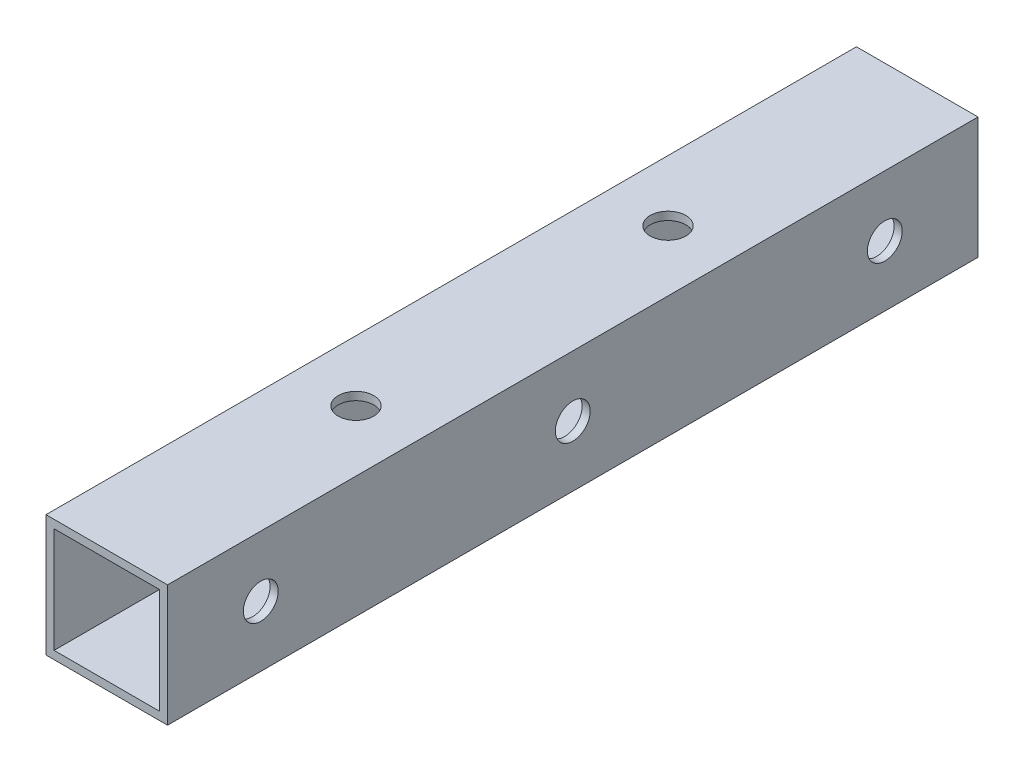
ISO-10303-21;
HEADER;
FILE_DESCRIPTION(('STEP AP214'),'2;1');
FILE_NAME('part.step','',(''),(''),'','','');
FILE_SCHEMA(('AUTOMOTIVE_DESIGN { 1 0 10303 214 1 1 1 1 }'));
ENDSEC;
DATA;
#1=APPLICATION_CONTEXT('core data for automotive mechanical design processes');
#2=APPLICATION_PROTOCOL_DEFINITION('international standard','automotive_design',2000,#1);
#3=PRODUCT_CONTEXT('',#1,'mechanical');
#4=PRODUCT('Part','Part','',(#3));
#5=PRODUCT_RELATED_PRODUCT_CATEGORY('part','',(#4));
#6=PRODUCT_DEFINITION_FORMATION('','',#4);
#7=PRODUCT_DEFINITION_CONTEXT('part definition',#1,'design');
#8=PRODUCT_DEFINITION('design','',#6,#7);
#9=PRODUCT_DEFINITION_SHAPE('','',#8);
#10=(LENGTH_UNIT() NAMED_UNIT(*) SI_UNIT(.MILLI.,.METRE.));
#11=(NAMED_UNIT(*) PLANE_ANGLE_UNIT() SI_UNIT($,.RADIAN.));
#12=(NAMED_UNIT(*) SI_UNIT($,.STERADIAN.) SOLID_ANGLE_UNIT());
#13=UNCERTAINTY_MEASURE_WITH_UNIT(LENGTH_MEASURE(1.E-05),#10,'distance_accuracy_value','');
#14=(GEOMETRIC_REPRESENTATION_CONTEXT(3) GLOBAL_UNCERTAINTY_ASSIGNED_CONTEXT((#13)) GLOBAL_UNIT_ASSIGNED_CONTEXT((#10,
#11,#12)) REPRESENTATION_CONTEXT('',''));
#15=CARTESIAN_POINT('',(0.,0.,0.));
#16=DIRECTION('',(0.,0.,1.));
#17=DIRECTION('',(1.,0.,0.));
#18=AXIS2_PLACEMENT_3D('',#15,#16,#17);
#19=CARTESIAN_POINT('',(0.,0.,100.));
#20=DIRECTION('',(0.,0.,1.));
#21=DIRECTION('',(1.,0.,0.));
#22=AXIS2_PLACEMENT_3D('',#19,#20,#21);
#23=PLANE('',#22);
#24=DIRECTION('',(0.,1.,0.));
#25=VECTOR('',#24,1.);
#26=CARTESIAN_POINT('',(7.5,7.5,100.));
#27=LINE('',#26,#25);
#28=CARTESIAN_POINT('',(7.5,-7.5,100.));
#29=VERTEX_POINT('',#28);
#30=CARTESIAN_POINT('',(7.5,7.5,100.));
#31=VERTEX_POINT('',#30);
#32=EDGE_CURVE('E143',#29,#31,#27,.T.);
#33=ORIENTED_EDGE('',*,*,#32,.T.);
#34=DIRECTION('',(-1.,0.,0.));
#35=VECTOR('',#34,1.);
#36=CARTESIAN_POINT('',(-7.5,7.5,100.));
#37=LINE('',#36,#35);
#38=CARTESIAN_POINT('',(-7.5,7.5,100.));
#39=VERTEX_POINT('',#38);
#40=EDGE_CURVE('E146',#31,#39,#37,.T.);
#41=ORIENTED_EDGE('',*,*,#40,.T.);
#42=DIRECTION('',(0.,-1.,0.));
#43=VECTOR('',#42,1.);
#44=CARTESIAN_POINT('',(-7.5,7.5,100.));
#45=LINE('',#44,#43);
#46=CARTESIAN_POINT('',(-7.5,-7.5,100.));
#47=VERTEX_POINT('',#46);
#48=EDGE_CURVE('E149',#39,#47,#45,.T.);
#49=ORIENTED_EDGE('',*,*,#48,.T.);
#50=DIRECTION('',(1.,0.,0.));
#51=VECTOR('',#50,1.);
#52=CARTESIAN_POINT('',(-7.5,-7.5,100.));
#53=LINE('',#52,#51);
#54=EDGE_CURVE('E151',#47,#29,#53,.T.);
#55=ORIENTED_EDGE('',*,*,#54,.T.);
#56=EDGE_LOOP('',(#33,#41,#49,#55));
#57=FACE_BOUND('',#56,.T.);
#58=DIRECTION('',(-1.,0.,0.));
#59=VECTOR('',#58,1.);
#60=CARTESIAN_POINT('',(-6.5,6.5,100.));
#61=LINE('',#60,#59);
#62=CARTESIAN_POINT('',(6.5,6.5,100.));
#63=VERTEX_POINT('',#62);
#64=CARTESIAN_POINT('',(-6.5,6.5,100.));
#65=VERTEX_POINT('',#64);
#66=EDGE_CURVE('E113',#63,#65,#61,.T.);
#67=ORIENTED_EDGE('',*,*,#66,.F.);
#68=DIRECTION('',(0.,1.,0.));
#69=VECTOR('',#68,1.);
#70=CARTESIAN_POINT('',(6.5,6.5,100.));
#71=LINE('',#70,#69);
#72=CARTESIAN_POINT('',(6.5,-6.5,100.));
#73=VERTEX_POINT('',#72);
#74=EDGE_CURVE('E105',#73,#63,#71,.T.);
#75=ORIENTED_EDGE('',*,*,#74,.F.);
#76=DIRECTION('',(1.,0.,0.));
#77=VECTOR('',#76,1.);
#78=CARTESIAN_POINT('',(-6.5,-6.5,100.));
#79=LINE('',#78,#77);
#80=CARTESIAN_POINT('',(-6.5,-6.5,100.));
#81=VERTEX_POINT('',#80);
#82=EDGE_CURVE('E127',#81,#73,#79,.T.);
#83=ORIENTED_EDGE('',*,*,#82,.F.);
#84=DIRECTION('',(0.,-1.,0.));
#85=VECTOR('',#84,1.);
#86=CARTESIAN_POINT('',(-6.5,6.5,100.));
#87=LINE('',#86,#85);
#88=EDGE_CURVE('E125',#65,#81,#87,.T.);
#89=ORIENTED_EDGE('',*,*,#88,.F.);
#90=EDGE_LOOP('',(#67,#75,#83,#89));
#91=FACE_BOUND('',#90,.T.);
#92=ADVANCED_FACE('F38',(#57,#91),#23,.T.);
#93=CARTESIAN_POINT('',(0.,0.,0.));
#94=DIRECTION('',(0.,0.,1.));
#95=DIRECTION('',(1.,0.,0.));
#96=AXIS2_PLACEMENT_3D('',#93,#94,#95);
#97=PLANE('',#96);
#98=DIRECTION('',(0.,1.,0.));
#99=VECTOR('',#98,1.);
#100=CARTESIAN_POINT('',(7.5,7.5,0.));
#101=LINE('',#100,#99);
#102=CARTESIAN_POINT('',(7.5,-7.5,0.));
#103=VERTEX_POINT('',#102);
#104=CARTESIAN_POINT('',(7.5,7.5,0.));
#105=VERTEX_POINT('',#104);
#106=EDGE_CURVE('E121',#103,#105,#101,.T.);
#107=ORIENTED_EDGE('',*,*,#106,.F.);
#108=DIRECTION('',(1.,0.,0.));
#109=VECTOR('',#108,1.);
#110=CARTESIAN_POINT('',(-7.5,-7.5,0.));
#111=LINE('',#110,#109);
#112=CARTESIAN_POINT('',(-7.5,-7.5,0.));
#113=VERTEX_POINT('',#112);
#114=EDGE_CURVE('E147',#113,#103,#111,.T.);
#115=ORIENTED_EDGE('',*,*,#114,.F.);
#116=DIRECTION('',(0.,-1.,0.));
#117=VECTOR('',#116,1.);
#118=CARTESIAN_POINT('',(-7.5,7.5,0.));
#119=LINE('',#118,#117);
#120=CARTESIAN_POINT('',(-7.5,7.5,0.));
#121=VERTEX_POINT('',#120);
#122=EDGE_CURVE('E158',#121,#113,#119,.T.);
#123=ORIENTED_EDGE('',*,*,#122,.F.);
#124=DIRECTION('',(-1.,0.,0.));
#125=VECTOR('',#124,1.);
#126=CARTESIAN_POINT('',(-7.5,7.5,0.));
#127=LINE('',#126,#125);
#128=EDGE_CURVE('E156',#105,#121,#127,.T.);
#129=ORIENTED_EDGE('',*,*,#128,.F.);
#130=EDGE_LOOP('',(#107,#115,#123,#129));
#131=FACE_BOUND('',#130,.T.);
#132=DIRECTION('',(0.,1.,0.));
#133=VECTOR('',#132,1.);
#134=CARTESIAN_POINT('',(6.5,6.5,0.));
#135=LINE('',#134,#133);
#136=CARTESIAN_POINT('',(6.5,-6.5,0.));
#137=VERTEX_POINT('',#136);
#138=CARTESIAN_POINT('',(6.5,6.5,0.));
#139=VERTEX_POINT('',#138);
#140=EDGE_CURVE('E63',#137,#139,#135,.T.);
#141=ORIENTED_EDGE('',*,*,#140,.T.);
#142=DIRECTION('',(-1.,0.,0.));
#143=VECTOR('',#142,1.);
#144=CARTESIAN_POINT('',(-6.5,6.5,0.));
#145=LINE('',#144,#143);
#146=CARTESIAN_POINT('',(-6.5,6.5,0.));
#147=VERTEX_POINT('',#146);
#148=EDGE_CURVE('E120',#139,#147,#145,.T.);
#149=ORIENTED_EDGE('',*,*,#148,.T.);
#150=DIRECTION('',(0.,-1.,0.));
#151=VECTOR('',#150,1.);
#152=CARTESIAN_POINT('',(-6.5,6.5,0.));
#153=LINE('',#152,#151);
#154=CARTESIAN_POINT('',(-6.5,-6.5,0.));
#155=VERTEX_POINT('',#154);
#156=EDGE_CURVE('E135',#147,#155,#153,.T.);
#157=ORIENTED_EDGE('',*,*,#156,.T.);
#158=DIRECTION('',(1.,0.,0.));
#159=VECTOR('',#158,1.);
#160=CARTESIAN_POINT('',(-6.5,-6.5,0.));
#161=LINE('',#160,#159);
#162=EDGE_CURVE('E114',#155,#137,#161,.T.);
#163=ORIENTED_EDGE('',*,*,#162,.T.);
#164=EDGE_LOOP('',(#141,#149,#157,#163));
#165=FACE_BOUND('',#164,.T.);
#166=ADVANCED_FACE('F251',(#131,#165),#97,.F.);
#167=CARTESIAN_POINT('',(7.5,7.5,100.));
#168=DIRECTION('',(-1.,0.,0.));
#169=DIRECTION('',(0.,-1.,0.));
#170=AXIS2_PLACEMENT_3D('',#167,#168,#169);
#171=PLANE('',#170);
#172=CARTESIAN_POINT('',(7.5,0.,11.5));
#173=DIRECTION('',(1.,0.,0.));
#174=DIRECTION('',(0.,1.,0.));
#175=AXIS2_PLACEMENT_3D('',#172,#173,#174);
#176=CIRCLE('',#175,2.15);
#177=CARTESIAN_POINT('',(7.5,2.15000000000001,11.5));
#178=VERTEX_POINT('',#177);
#179=EDGE_CURVE('E207',#178,#178,#176,.T.);
#180=ORIENTED_EDGE('',*,*,#179,.F.);
#181=EDGE_LOOP('',(#180));
#182=FACE_BOUND('',#181,.T.);
#183=CARTESIAN_POINT('',(7.5,0.,88.5));
#184=DIRECTION('',(1.,0.,0.));
#185=DIRECTION('',(0.,1.,0.));
#186=AXIS2_PLACEMENT_3D('',#183,#184,#185);
#187=CIRCLE('',#186,2.15);
#188=CARTESIAN_POINT('',(7.5,2.15,88.5));
#189=VERTEX_POINT('',#188);
#190=EDGE_CURVE('E208',#189,#189,#187,.T.);
#191=ORIENTED_EDGE('',*,*,#190,.F.);
#192=EDGE_LOOP('',(#191));
#193=FACE_BOUND('',#192,.T.);
#194=CARTESIAN_POINT('',(7.5,0.,50.));
#195=DIRECTION('',(1.,0.,0.));
#196=DIRECTION('',(0.,1.,0.));
#197=AXIS2_PLACEMENT_3D('',#194,#195,#196);
#198=CIRCLE('',#197,2.15);
#199=CARTESIAN_POINT('',(7.5,2.15,50.));
#200=VERTEX_POINT('',#199);
#201=EDGE_CURVE('E172',#200,#200,#198,.T.);
#202=ORIENTED_EDGE('',*,*,#201,.F.);
#203=EDGE_LOOP('',(#202));
#204=FACE_BOUND('',#203,.T.);
#205=ORIENTED_EDGE('',*,*,#106,.T.);
#206=DIRECTION('',(0.,0.,-1.));
#207=VECTOR('',#206,1.);
#208=CARTESIAN_POINT('',(7.5,7.5,100.));
#209=LINE('',#208,#207);
#210=EDGE_CURVE('E11',#31,#105,#209,.T.);
#211=ORIENTED_EDGE('',*,*,#210,.F.);
#212=ORIENTED_EDGE('',*,*,#32,.F.);
#213=DIRECTION('',(0.,0.,-1.));
#214=VECTOR('',#213,1.);
#215=CARTESIAN_POINT('',(7.5,-7.5,100.));
#216=LINE('',#215,#214);
#217=EDGE_CURVE('E153',#29,#103,#216,.T.);
#218=ORIENTED_EDGE('',*,*,#217,.T.);
#219=EDGE_LOOP('',(#205,#211,#212,#218));
#220=FACE_BOUND('',#219,.T.);
#221=ADVANCED_FACE('F40',(#182,#193,#204,#220),#171,.F.);
#222=CARTESIAN_POINT('',(-7.5,7.5,100.));
#223=DIRECTION('',(0.,-1.,0.));
#224=DIRECTION('',(0.,0.,-1.));
#225=AXIS2_PLACEMENT_3D('',#222,#223,#224);
#226=PLANE('',#225);
#227=CARTESIAN_POINT('',(0.,7.5,30.75));
#228=DIRECTION('',(0.,1.,0.));
#229=DIRECTION('',(0.,0.,1.));
#230=AXIS2_PLACEMENT_3D('',#227,#228,#229);
#231=CIRCLE('',#230,2.2);
#232=CARTESIAN_POINT('',(0.,7.5,32.95));
#233=VERTEX_POINT('',#232);
#234=EDGE_CURVE('E185',#233,#233,#231,.T.);
#235=ORIENTED_EDGE('',*,*,#234,.F.);
#236=EDGE_LOOP('',(#235));
#237=FACE_BOUND('',#236,.T.);
#238=CARTESIAN_POINT('',(0.,7.5,69.25));
#239=DIRECTION('',(0.,1.,0.));
#240=DIRECTION('',(0.,0.,1.));
#241=AXIS2_PLACEMENT_3D('',#238,#239,#240);
#242=CIRCLE('',#241,2.2);
#243=CARTESIAN_POINT('',(0.,7.5,71.45));
#244=VERTEX_POINT('',#243);
#245=EDGE_CURVE('E192',#244,#244,#242,.T.);
#246=ORIENTED_EDGE('',*,*,#245,.F.);
#247=EDGE_LOOP('',(#246));
#248=FACE_BOUND('',#247,.T.);
#249=ORIENTED_EDGE('',*,*,#128,.T.);
#250=DIRECTION('',(0.,0.,-1.));
#251=VECTOR('',#250,1.);
#252=CARTESIAN_POINT('',(-7.5,7.5,100.));
#253=LINE('',#252,#251);
#254=EDGE_CURVE('E47',#39,#121,#253,.T.);
#255=ORIENTED_EDGE('',*,*,#254,.F.);
#256=ORIENTED_EDGE('',*,*,#40,.F.);
#257=ORIENTED_EDGE('',*,*,#210,.T.);
#258=EDGE_LOOP('',(#249,#255,#256,#257));
#259=FACE_BOUND('',#258,.T.);
#260=ADVANCED_FACE('F267',(#237,#248,#259),#226,.F.);
#261=CARTESIAN_POINT('',(-7.5,7.5,100.));
#262=DIRECTION('',(1.,0.,0.));
#263=DIRECTION('',(0.,1.,0.));
#264=AXIS2_PLACEMENT_3D('',#261,#262,#263);
#265=PLANE('',#264);
#266=CARTESIAN_POINT('',(-7.50000000000001,0.,11.5));
#267=DIRECTION('',(1.,0.,0.));
#268=DIRECTION('',(0.,1.,0.));
#269=AXIS2_PLACEMENT_3D('',#266,#267,#268);
#270=CIRCLE('',#269,2.15);
#271=CARTESIAN_POINT('',(-7.50000000000001,2.15000000000001,11.5));
#272=VERTEX_POINT('',#271);
#273=EDGE_CURVE('E133',#272,#272,#270,.T.);
#274=ORIENTED_EDGE('',*,*,#273,.T.);
#275=EDGE_LOOP('',(#274));
#276=FACE_BOUND('',#275,.T.);
#277=CARTESIAN_POINT('',(-7.50000000000001,0.,88.5));
#278=DIRECTION('',(1.,0.,0.));
#279=DIRECTION('',(0.,1.,0.));
#280=AXIS2_PLACEMENT_3D('',#277,#278,#279);
#281=CIRCLE('',#280,2.15);
#282=CARTESIAN_POINT('',(-7.50000000000001,2.15,88.5));
#283=VERTEX_POINT('',#282);
#284=EDGE_CURVE('E181',#283,#283,#281,.T.);
#285=ORIENTED_EDGE('',*,*,#284,.T.);
#286=EDGE_LOOP('',(#285));
#287=FACE_BOUND('',#286,.T.);
#288=CARTESIAN_POINT('',(-7.50000000000001,0.,50.));
#289=DIRECTION('',(1.,0.,0.));
#290=DIRECTION('',(0.,1.,0.));
#291=AXIS2_PLACEMENT_3D('',#288,#289,#290);
#292=CIRCLE('',#291,2.15);
#293=CARTESIAN_POINT('',(-7.50000000000001,2.15,50.));
#294=VERTEX_POINT('',#293);
#295=EDGE_CURVE('E177',#294,#294,#292,.T.);
#296=ORIENTED_EDGE('',*,*,#295,.T.);
#297=EDGE_LOOP('',(#296));
#298=FACE_BOUND('',#297,.T.);
#299=ORIENTED_EDGE('',*,*,#122,.T.);
#300=DIRECTION('',(0.,0.,-1.));
#301=VECTOR('',#300,1.);
#302=CARTESIAN_POINT('',(-7.5,-7.5,100.));
#303=LINE('',#302,#301);
#304=EDGE_CURVE('E163',#47,#113,#303,.T.);
#305=ORIENTED_EDGE('',*,*,#304,.F.);
#306=ORIENTED_EDGE('',*,*,#48,.F.);
#307=ORIENTED_EDGE('',*,*,#254,.T.);
#308=EDGE_LOOP('',(#299,#305,#306,#307));
#309=FACE_BOUND('',#308,.T.);
#310=ADVANCED_FACE('F227',(#276,#287,#298,#309),#265,.F.);
#311=CARTESIAN_POINT('',(-7.5,-7.5,100.));
#312=DIRECTION('',(0.,1.,0.));
#313=DIRECTION('',(0.,0.,1.));
#314=AXIS2_PLACEMENT_3D('',#311,#312,#313);
#315=PLANE('',#314);
#316=CARTESIAN_POINT('',(0.,-7.5,30.75));
#317=DIRECTION('',(0.,1.,0.));
#318=DIRECTION('',(0.,0.,1.));
#319=AXIS2_PLACEMENT_3D('',#316,#317,#318);
#320=CIRCLE('',#319,2.2);
#321=CARTESIAN_POINT('',(0.,-7.5,32.95));
#322=VERTEX_POINT('',#321);
#323=EDGE_CURVE('E204',#322,#322,#320,.T.);
#324=ORIENTED_EDGE('',*,*,#323,.T.);
#325=EDGE_LOOP('',(#324));
#326=FACE_BOUND('',#325,.T.);
#327=CARTESIAN_POINT('',(0.,-7.5,69.25));
#328=DIRECTION('',(0.,1.,0.));
#329=DIRECTION('',(0.,0.,1.));
#330=AXIS2_PLACEMENT_3D('',#327,#328,#329);
#331=CIRCLE('',#330,2.2);
#332=CARTESIAN_POINT('',(0.,-7.5,71.45));
#333=VERTEX_POINT('',#332);
#334=EDGE_CURVE('E189',#333,#333,#331,.T.);
#335=ORIENTED_EDGE('',*,*,#334,.T.);
#336=EDGE_LOOP('',(#335));
#337=FACE_BOUND('',#336,.T.);
#338=ORIENTED_EDGE('',*,*,#114,.T.);
#339=ORIENTED_EDGE('',*,*,#217,.F.);
#340=ORIENTED_EDGE('',*,*,#54,.F.);
#341=ORIENTED_EDGE('',*,*,#304,.T.);
#342=EDGE_LOOP('',(#338,#339,#340,#341));
#343=FACE_BOUND('',#342,.T.);
#344=ADVANCED_FACE('F262',(#326,#337,#343),#315,.F.);
#345=CARTESIAN_POINT('',(6.5,6.5,100.));
#346=DIRECTION('',(-1.,0.,0.));
#347=DIRECTION('',(0.,0.,1.));
#348=AXIS2_PLACEMENT_3D('',#345,#346,#347);
#349=PLANE('',#348);
#350=CARTESIAN_POINT('',(6.50000000000001,0.,11.5));
#351=DIRECTION('',(-1.,0.,0.));
#352=DIRECTION('',(0.,0.,1.));
#353=AXIS2_PLACEMENT_3D('',#350,#351,#352);
#354=CIRCLE('',#353,2.15);
#355=CARTESIAN_POINT('',(6.50000000000001,0.,13.65));
#356=VERTEX_POINT('',#355);
#357=EDGE_CURVE('E180',#356,#356,#354,.T.);
#358=ORIENTED_EDGE('',*,*,#357,.F.);
#359=EDGE_LOOP('',(#358));
#360=FACE_BOUND('',#359,.T.);
#361=CARTESIAN_POINT('',(6.50000000000001,0.,88.5));
#362=DIRECTION('',(-1.,0.,0.));
#363=DIRECTION('',(0.,0.,1.));
#364=AXIS2_PLACEMENT_3D('',#361,#362,#363);
#365=CIRCLE('',#364,2.15);
#366=CARTESIAN_POINT('',(6.50000000000001,0.,90.65));
#367=VERTEX_POINT('',#366);
#368=EDGE_CURVE('E176',#367,#367,#365,.T.);
#369=ORIENTED_EDGE('',*,*,#368,.F.);
#370=EDGE_LOOP('',(#369));
#371=FACE_BOUND('',#370,.T.);
#372=CARTESIAN_POINT('',(6.50000000000001,0.,50.));
#373=DIRECTION('',(-1.,0.,0.));
#374=DIRECTION('',(0.,0.,1.));
#375=AXIS2_PLACEMENT_3D('',#372,#373,#374);
#376=CIRCLE('',#375,2.15);
#377=CARTESIAN_POINT('',(6.50000000000001,0.,52.15));
#378=VERTEX_POINT('',#377);
#379=EDGE_CURVE('E171',#378,#378,#376,.T.);
#380=ORIENTED_EDGE('',*,*,#379,.F.);
#381=EDGE_LOOP('',(#380));
#382=FACE_BOUND('',#381,.T.);
#383=ORIENTED_EDGE('',*,*,#140,.F.);
#384=DIRECTION('',(0.,0.,-1.));
#385=VECTOR('',#384,1.);
#386=CARTESIAN_POINT('',(6.5,-6.5,100.));
#387=LINE('',#386,#385);
#388=EDGE_CURVE('E109',#73,#137,#387,.T.);
#389=ORIENTED_EDGE('',*,*,#388,.F.);
#390=ORIENTED_EDGE('',*,*,#74,.T.);
#391=DIRECTION('',(0.,0.,-1.));
#392=VECTOR('',#391,1.);
#393=CARTESIAN_POINT('',(6.5,6.5,100.));
#394=LINE('',#393,#392);
#395=EDGE_CURVE('E108',#63,#139,#394,.T.);
#396=ORIENTED_EDGE('',*,*,#395,.T.);
#397=EDGE_LOOP('',(#383,#389,#390,#396));
#398=FACE_BOUND('',#397,.T.);
#399=ADVANCED_FACE('F107',(#360,#371,#382,#398),#349,.T.);
#400=CARTESIAN_POINT('',(-6.5,6.5,100.));
#401=DIRECTION('',(0.,-1.,0.));
#402=DIRECTION('',(0.,0.,-1.));
#403=AXIS2_PLACEMENT_3D('',#400,#401,#402);
#404=PLANE('',#403);
#405=CARTESIAN_POINT('',(0.,6.5,30.75));
#406=DIRECTION('',(0.,-1.,0.));
#407=DIRECTION('',(0.,0.,-1.));
#408=AXIS2_PLACEMENT_3D('',#405,#406,#407);
#409=CIRCLE('',#408,2.2);
#410=CARTESIAN_POINT('',(0.,6.5,28.55));
#411=VERTEX_POINT('',#410);
#412=EDGE_CURVE('E201',#411,#411,#409,.T.);
#413=ORIENTED_EDGE('',*,*,#412,.F.);
#414=EDGE_LOOP('',(#413));
#415=FACE_BOUND('',#414,.T.);
#416=CARTESIAN_POINT('',(0.,6.5,69.25));
#417=DIRECTION('',(0.,-1.,0.));
#418=DIRECTION('',(0.,0.,-1.));
#419=AXIS2_PLACEMENT_3D('',#416,#417,#418);
#420=CIRCLE('',#419,2.2);
#421=CARTESIAN_POINT('',(0.,6.5,67.05));
#422=VERTEX_POINT('',#421);
#423=EDGE_CURVE('E184',#422,#422,#420,.T.);
#424=ORIENTED_EDGE('',*,*,#423,.F.);
#425=EDGE_LOOP('',(#424));
#426=FACE_BOUND('',#425,.T.);
#427=ORIENTED_EDGE('',*,*,#148,.F.);
#428=ORIENTED_EDGE('',*,*,#395,.F.);
#429=ORIENTED_EDGE('',*,*,#66,.T.);
#430=DIRECTION('',(0.,0.,-1.));
#431=VECTOR('',#430,1.);
#432=CARTESIAN_POINT('',(-6.5,6.5,100.));
#433=LINE('',#432,#431);
#434=EDGE_CURVE('E122',#65,#147,#433,.T.);
#435=ORIENTED_EDGE('',*,*,#434,.T.);
#436=EDGE_LOOP('',(#427,#428,#429,#435));
#437=FACE_BOUND('',#436,.T.);
#438=ADVANCED_FACE('F117',(#415,#426,#437),#404,.T.);
#439=CARTESIAN_POINT('',(-6.5,6.5,100.));
#440=DIRECTION('',(1.,0.,0.));
#441=DIRECTION('',(0.,0.,-1.));
#442=AXIS2_PLACEMENT_3D('',#439,#440,#441);
#443=PLANE('',#442);
#444=CARTESIAN_POINT('',(-6.50000000000001,0.,11.5));
#445=DIRECTION('',(1.,0.,0.));
#446=DIRECTION('',(0.,0.,-1.));
#447=AXIS2_PLACEMENT_3D('',#444,#445,#446);
#448=CIRCLE('',#447,2.15);
#449=CARTESIAN_POINT('',(-6.50000000000001,0.,9.35000000000001));
#450=VERTEX_POINT('',#449);
#451=EDGE_CURVE('E178',#450,#450,#448,.T.);
#452=ORIENTED_EDGE('',*,*,#451,.F.);
#453=EDGE_LOOP('',(#452));
#454=FACE_BOUND('',#453,.T.);
#455=CARTESIAN_POINT('',(-6.50000000000001,0.,88.5));
#456=DIRECTION('',(1.,0.,0.));
#457=DIRECTION('',(0.,0.,-1.));
#458=AXIS2_PLACEMENT_3D('',#455,#456,#457);
#459=CIRCLE('',#458,2.15);
#460=CARTESIAN_POINT('',(-6.50000000000001,0.,86.35));
#461=VERTEX_POINT('',#460);
#462=EDGE_CURVE('E173',#461,#461,#459,.T.);
#463=ORIENTED_EDGE('',*,*,#462,.F.);
#464=EDGE_LOOP('',(#463));
#465=FACE_BOUND('',#464,.T.);
#466=CARTESIAN_POINT('',(-6.50000000000001,0.,50.));
#467=DIRECTION('',(1.,0.,0.));
#468=DIRECTION('',(0.,0.,-1.));
#469=AXIS2_PLACEMENT_3D('',#466,#467,#468);
#470=CIRCLE('',#469,2.15);
#471=CARTESIAN_POINT('',(-6.50000000000001,0.,47.85));
#472=VERTEX_POINT('',#471);
#473=EDGE_CURVE('E168',#472,#472,#470,.T.);
#474=ORIENTED_EDGE('',*,*,#473,.F.);
#475=EDGE_LOOP('',(#474));
#476=FACE_BOUND('',#475,.T.);
#477=ORIENTED_EDGE('',*,*,#156,.F.);
#478=ORIENTED_EDGE('',*,*,#434,.F.);
#479=ORIENTED_EDGE('',*,*,#88,.T.);
#480=DIRECTION('',(0.,0.,-1.));
#481=VECTOR('',#480,1.);
#482=CARTESIAN_POINT('',(-6.5,-6.5,100.));
#483=LINE('',#482,#481);
#484=EDGE_CURVE('E55',#81,#155,#483,.T.);
#485=ORIENTED_EDGE('',*,*,#484,.T.);
#486=EDGE_LOOP('',(#477,#478,#479,#485));
#487=FACE_BOUND('',#486,.T.);
#488=ADVANCED_FACE('F294',(#454,#465,#476,#487),#443,.T.);
#489=CARTESIAN_POINT('',(-6.5,-6.5,100.));
#490=DIRECTION('',(0.,1.,0.));
#491=DIRECTION('',(0.,0.,1.));
#492=AXIS2_PLACEMENT_3D('',#489,#490,#491);
#493=PLANE('',#492);
#494=CARTESIAN_POINT('',(0.,-6.5,30.75));
#495=DIRECTION('',(0.,1.,0.));
#496=DIRECTION('',(0.,0.,1.));
#497=AXIS2_PLACEMENT_3D('',#494,#495,#496);
#498=CIRCLE('',#497,2.2);
#499=CARTESIAN_POINT('',(0.,-6.5,32.95));
#500=VERTEX_POINT('',#499);
#501=EDGE_CURVE('E42',#500,#500,#498,.T.);
#502=ORIENTED_EDGE('',*,*,#501,.F.);
#503=EDGE_LOOP('',(#502));
#504=FACE_BOUND('',#503,.T.);
#505=CARTESIAN_POINT('',(0.,-6.5,69.25));
#506=DIRECTION('',(0.,1.,0.));
#507=DIRECTION('',(0.,0.,1.));
#508=AXIS2_PLACEMENT_3D('',#505,#506,#507);
#509=CIRCLE('',#508,2.2);
#510=CARTESIAN_POINT('',(0.,-6.5,71.45));
#511=VERTEX_POINT('',#510);
#512=EDGE_CURVE('E182',#511,#511,#509,.T.);
#513=ORIENTED_EDGE('',*,*,#512,.F.);
#514=EDGE_LOOP('',(#513));
#515=FACE_BOUND('',#514,.T.);
#516=ORIENTED_EDGE('',*,*,#162,.F.);
#517=ORIENTED_EDGE('',*,*,#484,.F.);
#518=ORIENTED_EDGE('',*,*,#82,.T.);
#519=ORIENTED_EDGE('',*,*,#388,.T.);
#520=EDGE_LOOP('',(#516,#517,#518,#519));
#521=FACE_BOUND('',#520,.T.);
#522=ADVANCED_FACE('F292',(#504,#515,#521),#493,.T.);
#523=CARTESIAN_POINT('',(-358.5,0.,50.));
#524=DIRECTION('',(1.,0.,0.));
#525=DIRECTION('',(0.,1.,0.));
#526=AXIS2_PLACEMENT_3D('',#523,#524,#525);
#527=CYLINDRICAL_SURFACE('',#526,2.15);
#528=ORIENTED_EDGE('',*,*,#473,.T.);
#529=EDGE_LOOP('',(#528));
#530=FACE_BOUND('',#529,.T.);
#531=ORIENTED_EDGE('',*,*,#295,.F.);
#532=EDGE_LOOP('',(#531));
#533=FACE_BOUND('',#532,.T.);
#534=ADVANCED_FACE('F244',(#530,#533),#527,.F.);
#535=CARTESIAN_POINT('',(-358.5,0.,88.5));
#536=DIRECTION('',(1.,0.,0.));
#537=DIRECTION('',(0.,1.,0.));
#538=AXIS2_PLACEMENT_3D('',#535,#536,#537);
#539=CYLINDRICAL_SURFACE('',#538,2.15);
#540=ORIENTED_EDGE('',*,*,#462,.T.);
#541=EDGE_LOOP('',(#540));
#542=FACE_BOUND('',#541,.T.);
#543=ORIENTED_EDGE('',*,*,#284,.F.);
#544=EDGE_LOOP('',(#543));
#545=FACE_BOUND('',#544,.T.);
#546=ADVANCED_FACE('F233',(#542,#545),#539,.F.);
#547=CARTESIAN_POINT('',(-358.5,0.,11.5));
#548=DIRECTION('',(1.,0.,0.));
#549=DIRECTION('',(0.,1.,0.));
#550=AXIS2_PLACEMENT_3D('',#547,#548,#549);
#551=CYLINDRICAL_SURFACE('',#550,2.15);
#552=ORIENTED_EDGE('',*,*,#451,.T.);
#553=EDGE_LOOP('',(#552));
#554=FACE_BOUND('',#553,.T.);
#555=ORIENTED_EDGE('',*,*,#273,.F.);
#556=EDGE_LOOP('',(#555));
#557=FACE_BOUND('',#556,.T.);
#558=ADVANCED_FACE('F230',(#554,#557),#551,.F.);
#559=ORIENTED_EDGE('',*,*,#379,.T.);
#560=EDGE_LOOP('',(#559));
#561=FACE_BOUND('',#560,.T.);
#562=ORIENTED_EDGE('',*,*,#201,.T.);
#563=EDGE_LOOP('',(#562));
#564=FACE_BOUND('',#563,.T.);
#565=ADVANCED_FACE('F232',(#561,#564),#527,.F.);
#566=ORIENTED_EDGE('',*,*,#368,.T.);
#567=EDGE_LOOP('',(#566));
#568=FACE_BOUND('',#567,.T.);
#569=ORIENTED_EDGE('',*,*,#190,.T.);
#570=EDGE_LOOP('',(#569));
#571=FACE_BOUND('',#570,.T.);
#572=ADVANCED_FACE('F241',(#568,#571),#539,.F.);
#573=ORIENTED_EDGE('',*,*,#357,.T.);
#574=EDGE_LOOP('',(#573));
#575=FACE_BOUND('',#574,.T.);
#576=ORIENTED_EDGE('',*,*,#179,.T.);
#577=EDGE_LOOP('',(#576));
#578=FACE_BOUND('',#577,.T.);
#579=ADVANCED_FACE('F236',(#575,#578),#551,.F.);
#580=CARTESIAN_POINT('',(0.,-47.5,69.25));
#581=DIRECTION('',(0.,1.,0.));
#582=DIRECTION('',(0.,0.,1.));
#583=AXIS2_PLACEMENT_3D('',#580,#581,#582);
#584=CYLINDRICAL_SURFACE('',#583,2.2);
#585=ORIENTED_EDGE('',*,*,#512,.T.);
#586=EDGE_LOOP('',(#585));
#587=FACE_BOUND('',#586,.T.);
#588=ORIENTED_EDGE('',*,*,#334,.F.);
#589=EDGE_LOOP('',(#588));
#590=FACE_BOUND('',#589,.T.);
#591=ADVANCED_FACE('F248',(#587,#590),#584,.F.);
#592=CARTESIAN_POINT('',(0.,-47.5,30.75));
#593=DIRECTION('',(0.,1.,0.));
#594=DIRECTION('',(0.,0.,1.));
#595=AXIS2_PLACEMENT_3D('',#592,#593,#594);
#596=CYLINDRICAL_SURFACE('',#595,2.2);
#597=ORIENTED_EDGE('',*,*,#501,.T.);
#598=EDGE_LOOP('',(#597));
#599=FACE_BOUND('',#598,.T.);
#600=ORIENTED_EDGE('',*,*,#323,.F.);
#601=EDGE_LOOP('',(#600));
#602=FACE_BOUND('',#601,.T.);
#603=ADVANCED_FACE('F320',(#599,#602),#596,.F.);
#604=ORIENTED_EDGE('',*,*,#423,.T.);
#605=EDGE_LOOP('',(#604));
#606=FACE_BOUND('',#605,.T.);
#607=ORIENTED_EDGE('',*,*,#245,.T.);
#608=EDGE_LOOP('',(#607));
#609=FACE_BOUND('',#608,.T.);
#610=ADVANCED_FACE('F316',(#606,#609),#584,.F.);
#611=ORIENTED_EDGE('',*,*,#412,.T.);
#612=EDGE_LOOP('',(#611));
#613=FACE_BOUND('',#612,.T.);
#614=ORIENTED_EDGE('',*,*,#234,.T.);
#615=EDGE_LOOP('',(#614));
#616=FACE_BOUND('',#615,.T.);
#617=ADVANCED_FACE('F319',(#613,#616),#596,.F.);
#618=CLOSED_SHELL('',(#92,#166,#221,#260,#310,#344,#399,#438,#488,#522,#534,#546,#558,#565,#572,
#579,#591,#603,#610,#617));
#619=MANIFOLD_SOLID_BREP('B2',#618);
#620=ADVANCED_BREP_SHAPE_REPRESENTATION('',(#18,#619),#14);
#621=SHAPE_DEFINITION_REPRESENTATION(#9,#620);
ENDSEC;
END-ISO-10303-21;
